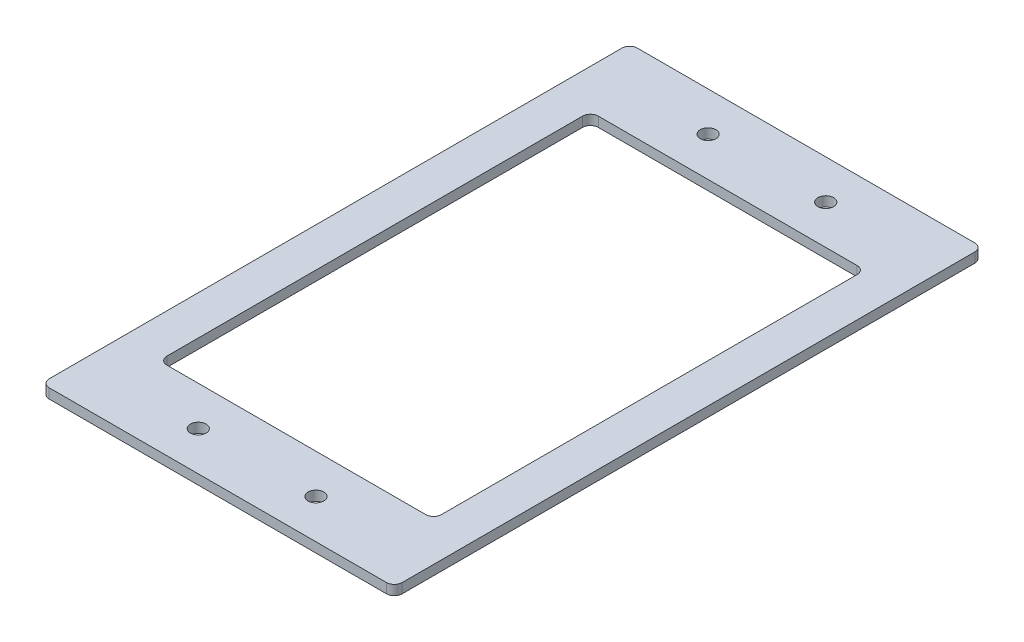
ISO-10303-21;
HEADER;
FILE_DESCRIPTION(('STEP AP214'),'2;1');
FILE_NAME('part.step','',(''),(''),'','','');
FILE_SCHEMA(('AUTOMOTIVE_DESIGN { 1 0 10303 214 1 1 1 1 }'));
ENDSEC;
DATA;
#1=APPLICATION_CONTEXT('core data for automotive mechanical design processes');
#2=APPLICATION_PROTOCOL_DEFINITION('international standard','automotive_design',2000,#1);
#3=PRODUCT_CONTEXT('',#1,'mechanical');
#4=PRODUCT('Part','Part','',(#3));
#5=PRODUCT_RELATED_PRODUCT_CATEGORY('part','',(#4));
#6=PRODUCT_DEFINITION_FORMATION('','',#4);
#7=PRODUCT_DEFINITION_CONTEXT('part definition',#1,'design');
#8=PRODUCT_DEFINITION('design','',#6,#7);
#9=PRODUCT_DEFINITION_SHAPE('','',#8);
#10=(LENGTH_UNIT() NAMED_UNIT(*) SI_UNIT(.MILLI.,.METRE.));
#11=(NAMED_UNIT(*) PLANE_ANGLE_UNIT() SI_UNIT($,.RADIAN.));
#12=(NAMED_UNIT(*) SI_UNIT($,.STERADIAN.) SOLID_ANGLE_UNIT());
#13=UNCERTAINTY_MEASURE_WITH_UNIT(LENGTH_MEASURE(1.E-05),#10,'distance_accuracy_value','');
#14=(GEOMETRIC_REPRESENTATION_CONTEXT(3) GLOBAL_UNCERTAINTY_ASSIGNED_CONTEXT((#13)) GLOBAL_UNIT_ASSIGNED_CONTEXT((#10,
#11,#12)) REPRESENTATION_CONTEXT('',''));
#15=CARTESIAN_POINT('',(0.,0.,0.));
#16=DIRECTION('',(0.,0.,1.));
#17=DIRECTION('',(1.,0.,0.));
#18=AXIS2_PLACEMENT_3D('',#15,#16,#17);
#19=CARTESIAN_POINT('',(0.,3.175,0.));
#20=DIRECTION('',(0.,1.,0.));
#21=DIRECTION('',(0.,0.,1.));
#22=AXIS2_PLACEMENT_3D('',#19,#20,#21);
#23=PLANE('',#22);
#24=CARTESIAN_POINT('',(-19.05,3.175,-82.55));
#25=DIRECTION('',(0.,1.,0.));
#26=DIRECTION('',(0.,0.,1.));
#27=AXIS2_PLACEMENT_3D('',#24,#25,#26);
#28=CIRCLE('',#27,2.53999999999999);
#29=CARTESIAN_POINT('',(-19.05,3.175,-80.01));
#30=VERTEX_POINT('',#29);
#31=EDGE_CURVE('E280',#30,#30,#28,.T.);
#32=ORIENTED_EDGE('',*,*,#31,.F.);
#33=EDGE_LOOP('',(#32));
#34=FACE_BOUND('',#33,.T.);
#35=CARTESIAN_POINT('',(-19.05,3.175,82.55));
#36=DIRECTION('',(0.,1.,0.));
#37=DIRECTION('',(0.,0.,-1.));
#38=AXIS2_PLACEMENT_3D('',#35,#36,#37);
#39=CIRCLE('',#38,2.53999999999999);
#40=CARTESIAN_POINT('',(-19.05,3.175,85.09));
#41=VERTEX_POINT('',#40);
#42=EDGE_CURVE('E270',#41,#41,#39,.T.);
#43=ORIENTED_EDGE('',*,*,#42,.F.);
#44=EDGE_LOOP('',(#43));
#45=FACE_BOUND('',#44,.T.);
#46=CARTESIAN_POINT('',(19.05,3.175,-82.55));
#47=DIRECTION('',(0.,1.,0.));
#48=DIRECTION('',(0.,0.,-1.));
#49=AXIS2_PLACEMENT_3D('',#46,#47,#48);
#50=CIRCLE('',#49,2.53999999999999);
#51=CARTESIAN_POINT('',(19.05,3.175,-80.01));
#52=VERTEX_POINT('',#51);
#53=EDGE_CURVE('E267',#52,#52,#50,.T.);
#54=ORIENTED_EDGE('',*,*,#53,.F.);
#55=EDGE_LOOP('',(#54));
#56=FACE_BOUND('',#55,.T.);
#57=CARTESIAN_POINT('',(19.05,3.175,82.55));
#58=DIRECTION('',(0.,1.,0.));
#59=DIRECTION('',(0.,0.,1.));
#60=AXIS2_PLACEMENT_3D('',#57,#58,#59);
#61=CIRCLE('',#60,2.53999999999999);
#62=CARTESIAN_POINT('',(19.05,3.175,85.09));
#63=VERTEX_POINT('',#62);
#64=EDGE_CURVE('E264',#63,#63,#61,.T.);
#65=ORIENTED_EDGE('',*,*,#64,.F.);
#66=EDGE_LOOP('',(#65));
#67=FACE_BOUND('',#66,.T.);
#68=DIRECTION('',(0.,0.,1.));
#69=VECTOR('',#68,1.);
#70=CARTESIAN_POINT('',(-57.15,3.175,95.25));
#71=LINE('',#70,#69);
#72=CARTESIAN_POINT('',(-57.15,3.175,-92.71));
#73=VERTEX_POINT('',#72);
#74=CARTESIAN_POINT('',(-57.15,3.175,92.71));
#75=VERTEX_POINT('',#74);
#76=EDGE_CURVE('E254',#73,#75,#71,.T.);
#77=ORIENTED_EDGE('',*,*,#76,.T.);
#78=CARTESIAN_POINT('',(-54.61,3.175,92.71));
#79=DIRECTION('',(0.,1.,0.));
#80=DIRECTION('',(0.,0.,1.));
#81=AXIS2_PLACEMENT_3D('',#78,#79,#80);
#82=CIRCLE('',#81,2.54);
#83=CARTESIAN_POINT('',(-54.61,3.175,95.25));
#84=VERTEX_POINT('',#83);
#85=EDGE_CURVE('E231',#75,#84,#82,.T.);
#86=ORIENTED_EDGE('',*,*,#85,.T.);
#87=DIRECTION('',(1.,0.,0.));
#88=VECTOR('',#87,1.);
#89=CARTESIAN_POINT('',(57.15,3.175,95.25));
#90=LINE('',#89,#88);
#91=CARTESIAN_POINT('',(54.61,3.175,95.25));
#92=VERTEX_POINT('',#91);
#93=EDGE_CURVE('E302',#84,#92,#90,.T.);
#94=ORIENTED_EDGE('',*,*,#93,.T.);
#95=CARTESIAN_POINT('',(54.61,3.175,92.71));
#96=DIRECTION('',(0.,1.,0.));
#97=DIRECTION('',(0.,0.,1.));
#98=AXIS2_PLACEMENT_3D('',#95,#96,#97);
#99=CIRCLE('',#98,2.54);
#100=CARTESIAN_POINT('',(57.15,3.175,92.71));
#101=VERTEX_POINT('',#100);
#102=EDGE_CURVE('E226',#92,#101,#99,.T.);
#103=ORIENTED_EDGE('',*,*,#102,.T.);
#104=DIRECTION('',(0.,0.,-1.));
#105=VECTOR('',#104,1.);
#106=CARTESIAN_POINT('',(57.15,3.175,95.25));
#107=LINE('',#106,#105);
#108=CARTESIAN_POINT('',(57.15,3.175,-92.71));
#109=VERTEX_POINT('',#108);
#110=EDGE_CURVE('E177',#101,#109,#107,.T.);
#111=ORIENTED_EDGE('',*,*,#110,.T.);
#112=CARTESIAN_POINT('',(54.61,3.175,-92.71));
#113=DIRECTION('',(0.,1.,0.));
#114=DIRECTION('',(0.,0.,1.));
#115=AXIS2_PLACEMENT_3D('',#112,#113,#114);
#116=CIRCLE('',#115,2.54);
#117=CARTESIAN_POINT('',(54.61,3.175,-95.25));
#118=VERTEX_POINT('',#117);
#119=EDGE_CURVE('E55',#109,#118,#116,.T.);
#120=ORIENTED_EDGE('',*,*,#119,.T.);
#121=DIRECTION('',(-1.,0.,0.));
#122=VECTOR('',#121,1.);
#123=CARTESIAN_POINT('',(57.15,3.175,-95.25));
#124=LINE('',#123,#122);
#125=CARTESIAN_POINT('',(-54.61,3.175,-95.25));
#126=VERTEX_POINT('',#125);
#127=EDGE_CURVE('E173',#118,#126,#124,.T.);
#128=ORIENTED_EDGE('',*,*,#127,.T.);
#129=CARTESIAN_POINT('',(-54.61,3.175,-92.71));
#130=DIRECTION('',(0.,1.,0.));
#131=DIRECTION('',(0.,0.,1.));
#132=AXIS2_PLACEMENT_3D('',#129,#130,#131);
#133=CIRCLE('',#132,2.54);
#134=EDGE_CURVE('E229',#126,#73,#133,.T.);
#135=ORIENTED_EDGE('',*,*,#134,.T.);
#136=EDGE_LOOP('',(#77,#86,#94,#103,#111,#120,#128,#135));
#137=FACE_BOUND('',#136,.T.);
#138=DIRECTION('',(1.,0.,0.));
#139=VECTOR('',#138,1.);
#140=CARTESIAN_POINT('',(44.45,3.175,69.85));
#141=LINE('',#140,#139);
#142=CARTESIAN_POINT('',(-41.91,3.175,69.85));
#143=VERTEX_POINT('',#142);
#144=CARTESIAN_POINT('',(41.91,3.175,69.85));
#145=VERTEX_POINT('',#144);
#146=EDGE_CURVE('E288',#143,#145,#141,.T.);
#147=ORIENTED_EDGE('',*,*,#146,.F.);
#148=CARTESIAN_POINT('',(-41.91,3.175,67.31));
#149=DIRECTION('',(0.,1.,0.));
#150=DIRECTION('',(0.,0.,1.));
#151=AXIS2_PLACEMENT_3D('',#148,#149,#150);
#152=CIRCLE('',#151,2.54);
#153=CARTESIAN_POINT('',(-44.45,3.175,67.31));
#154=VERTEX_POINT('',#153);
#155=EDGE_CURVE('E159',#143,#154,#152,.F.);
#156=ORIENTED_EDGE('',*,*,#155,.T.);
#157=DIRECTION('',(0.,0.,1.));
#158=VECTOR('',#157,1.);
#159=CARTESIAN_POINT('',(-44.45,3.175,69.85));
#160=LINE('',#159,#158);
#161=CARTESIAN_POINT('',(-44.45,3.175,-67.31));
#162=VERTEX_POINT('',#161);
#163=EDGE_CURVE('E285',#162,#154,#160,.T.);
#164=ORIENTED_EDGE('',*,*,#163,.F.);
#165=CARTESIAN_POINT('',(-41.91,3.175,-67.31));
#166=DIRECTION('',(0.,1.,0.));
#167=DIRECTION('',(0.,0.,1.));
#168=AXIS2_PLACEMENT_3D('',#165,#166,#167);
#169=CIRCLE('',#168,2.54);
#170=CARTESIAN_POINT('',(-41.91,3.175,-69.85));
#171=VERTEX_POINT('',#170);
#172=EDGE_CURVE('E202',#162,#171,#169,.F.);
#173=ORIENTED_EDGE('',*,*,#172,.T.);
#174=DIRECTION('',(-1.,0.,0.));
#175=VECTOR('',#174,1.);
#176=CARTESIAN_POINT('',(44.45,3.175,-69.85));
#177=LINE('',#176,#175);
#178=CARTESIAN_POINT('',(41.91,3.175,-69.85));
#179=VERTEX_POINT('',#178);
#180=EDGE_CURVE('E293',#179,#171,#177,.T.);
#181=ORIENTED_EDGE('',*,*,#180,.F.);
#182=CARTESIAN_POINT('',(41.91,3.175,-67.31));
#183=DIRECTION('',(0.,1.,0.));
#184=DIRECTION('',(0.,0.,1.));
#185=AXIS2_PLACEMENT_3D('',#182,#183,#184);
#186=CIRCLE('',#185,2.54);
#187=CARTESIAN_POINT('',(44.45,3.175,-67.31));
#188=VERTEX_POINT('',#187);
#189=EDGE_CURVE('E198',#179,#188,#186,.F.);
#190=ORIENTED_EDGE('',*,*,#189,.T.);
#191=DIRECTION('',(0.,0.,-1.));
#192=VECTOR('',#191,1.);
#193=CARTESIAN_POINT('',(44.45,3.175,69.85));
#194=LINE('',#193,#192);
#195=CARTESIAN_POINT('',(44.45,3.175,67.31));
#196=VERTEX_POINT('',#195);
#197=EDGE_CURVE('E291',#196,#188,#194,.T.);
#198=ORIENTED_EDGE('',*,*,#197,.F.);
#199=CARTESIAN_POINT('',(41.91,3.175,67.31));
#200=DIRECTION('',(0.,1.,0.));
#201=DIRECTION('',(0.,0.,1.));
#202=AXIS2_PLACEMENT_3D('',#199,#200,#201);
#203=CIRCLE('',#202,2.54);
#204=EDGE_CURVE('E158',#196,#145,#203,.F.);
#205=ORIENTED_EDGE('',*,*,#204,.T.);
#206=EDGE_LOOP('',(#147,#156,#164,#173,#181,#190,#198,#205));
#207=FACE_BOUND('',#206,.T.);
#208=ADVANCED_FACE('F33',(#34,#45,#56,#67,#137,#207),#23,.T.);
#209=CARTESIAN_POINT('',(0.,0.,0.));
#210=DIRECTION('',(0.,1.,0.));
#211=DIRECTION('',(0.,0.,1.));
#212=AXIS2_PLACEMENT_3D('',#209,#210,#211);
#213=PLANE('',#212);
#214=CARTESIAN_POINT('',(-19.05,0.,-82.55));
#215=DIRECTION('',(0.,1.,0.));
#216=DIRECTION('',(0.,0.,1.));
#217=AXIS2_PLACEMENT_3D('',#214,#215,#216);
#218=CIRCLE('',#217,2.53999999999999);
#219=CARTESIAN_POINT('',(-19.05,0.,-80.01));
#220=VERTEX_POINT('',#219);
#221=EDGE_CURVE('E180',#220,#220,#218,.T.);
#222=ORIENTED_EDGE('',*,*,#221,.T.);
#223=EDGE_LOOP('',(#222));
#224=FACE_BOUND('',#223,.T.);
#225=CARTESIAN_POINT('',(-19.05,0.,82.55));
#226=DIRECTION('',(0.,1.,0.));
#227=DIRECTION('',(0.,0.,1.));
#228=AXIS2_PLACEMENT_3D('',#225,#226,#227);
#229=CIRCLE('',#228,2.53999999999999);
#230=CARTESIAN_POINT('',(-19.05,0.,85.09));
#231=VERTEX_POINT('',#230);
#232=EDGE_CURVE('E268',#231,#231,#229,.T.);
#233=ORIENTED_EDGE('',*,*,#232,.T.);
#234=EDGE_LOOP('',(#233));
#235=FACE_BOUND('',#234,.T.);
#236=CARTESIAN_POINT('',(19.05,0.,-82.55));
#237=DIRECTION('',(0.,1.,0.));
#238=DIRECTION('',(0.,0.,1.));
#239=AXIS2_PLACEMENT_3D('',#236,#237,#238);
#240=CIRCLE('',#239,2.53999999999999);
#241=CARTESIAN_POINT('',(19.05,0.,-80.01));
#242=VERTEX_POINT('',#241);
#243=EDGE_CURVE('E265',#242,#242,#240,.T.);
#244=ORIENTED_EDGE('',*,*,#243,.T.);
#245=EDGE_LOOP('',(#244));
#246=FACE_BOUND('',#245,.T.);
#247=CARTESIAN_POINT('',(19.05,0.,82.55));
#248=DIRECTION('',(0.,1.,0.));
#249=DIRECTION('',(0.,0.,1.));
#250=AXIS2_PLACEMENT_3D('',#247,#248,#249);
#251=CIRCLE('',#250,2.53999999999999);
#252=CARTESIAN_POINT('',(19.05,0.,85.09));
#253=VERTEX_POINT('',#252);
#254=EDGE_CURVE('E260',#253,#253,#251,.T.);
#255=ORIENTED_EDGE('',*,*,#254,.T.);
#256=EDGE_LOOP('',(#255));
#257=FACE_BOUND('',#256,.T.);
#258=DIRECTION('',(1.,0.,0.));
#259=VECTOR('',#258,1.);
#260=CARTESIAN_POINT('',(57.15,0.,95.25));
#261=LINE('',#260,#259);
#262=CARTESIAN_POINT('',(-54.61,0.,95.25));
#263=VERTEX_POINT('',#262);
#264=CARTESIAN_POINT('',(54.61,0.,95.25));
#265=VERTEX_POINT('',#264);
#266=EDGE_CURVE('E252',#263,#265,#261,.T.);
#267=ORIENTED_EDGE('',*,*,#266,.F.);
#268=CARTESIAN_POINT('',(-54.61,0.,92.71));
#269=DIRECTION('',(0.,1.,0.));
#270=DIRECTION('',(0.,0.,1.));
#271=AXIS2_PLACEMENT_3D('',#268,#269,#270);
#272=CIRCLE('',#271,2.54);
#273=CARTESIAN_POINT('',(-57.15,0.,92.71));
#274=VERTEX_POINT('',#273);
#275=EDGE_CURVE('E219',#263,#274,#272,.F.);
#276=ORIENTED_EDGE('',*,*,#275,.T.);
#277=DIRECTION('',(0.,0.,1.));
#278=VECTOR('',#277,1.);
#279=CARTESIAN_POINT('',(-57.15,0.,95.25));
#280=LINE('',#279,#278);
#281=CARTESIAN_POINT('',(-57.15,0.,-92.71));
#282=VERTEX_POINT('',#281);
#283=EDGE_CURVE('E256',#282,#274,#280,.T.);
#284=ORIENTED_EDGE('',*,*,#283,.F.);
#285=CARTESIAN_POINT('',(-54.61,0.,-92.71));
#286=DIRECTION('',(0.,1.,0.));
#287=DIRECTION('',(0.,0.,1.));
#288=AXIS2_PLACEMENT_3D('',#285,#286,#287);
#289=CIRCLE('',#288,2.54);
#290=CARTESIAN_POINT('',(-54.61,0.,-95.25));
#291=VERTEX_POINT('',#290);
#292=EDGE_CURVE('E217',#282,#291,#289,.F.);
#293=ORIENTED_EDGE('',*,*,#292,.T.);
#294=DIRECTION('',(-1.,0.,0.));
#295=VECTOR('',#294,1.);
#296=CARTESIAN_POINT('',(57.15,0.,-95.25));
#297=LINE('',#296,#295);
#298=CARTESIAN_POINT('',(54.61,0.,-95.25));
#299=VERTEX_POINT('',#298);
#300=EDGE_CURVE('E251',#299,#291,#297,.T.);
#301=ORIENTED_EDGE('',*,*,#300,.F.);
#302=CARTESIAN_POINT('',(54.61,0.,-92.71));
#303=DIRECTION('',(0.,1.,0.));
#304=DIRECTION('',(0.,0.,1.));
#305=AXIS2_PLACEMENT_3D('',#302,#303,#304);
#306=CIRCLE('',#305,2.54);
#307=CARTESIAN_POINT('',(57.15,0.,-92.71));
#308=VERTEX_POINT('',#307);
#309=EDGE_CURVE('E215',#299,#308,#306,.F.);
#310=ORIENTED_EDGE('',*,*,#309,.T.);
#311=DIRECTION('',(0.,0.,-1.));
#312=VECTOR('',#311,1.);
#313=CARTESIAN_POINT('',(57.15,0.,95.25));
#314=LINE('',#313,#312);
#315=CARTESIAN_POINT('',(57.15,0.,92.71));
#316=VERTEX_POINT('',#315);
#317=EDGE_CURVE('E243',#316,#308,#314,.T.);
#318=ORIENTED_EDGE('',*,*,#317,.F.);
#319=CARTESIAN_POINT('',(54.61,0.,92.71));
#320=DIRECTION('',(0.,1.,0.));
#321=DIRECTION('',(0.,0.,1.));
#322=AXIS2_PLACEMENT_3D('',#319,#320,#321);
#323=CIRCLE('',#322,2.54);
#324=EDGE_CURVE('E213',#316,#265,#323,.F.);
#325=ORIENTED_EDGE('',*,*,#324,.T.);
#326=EDGE_LOOP('',(#267,#276,#284,#293,#301,#310,#318,#325));
#327=FACE_BOUND('',#326,.T.);
#328=DIRECTION('',(-1.,0.,0.));
#329=VECTOR('',#328,1.);
#330=CARTESIAN_POINT('',(44.45,0.,-69.85));
#331=LINE('',#330,#329);
#332=CARTESIAN_POINT('',(41.91,0.,-69.85));
#333=VERTEX_POINT('',#332);
#334=CARTESIAN_POINT('',(-41.91,0.,-69.85));
#335=VERTEX_POINT('',#334);
#336=EDGE_CURVE('E169',#333,#335,#331,.T.);
#337=ORIENTED_EDGE('',*,*,#336,.T.);
#338=CARTESIAN_POINT('',(-41.91,0.,-67.31));
#339=DIRECTION('',(0.,1.,0.));
#340=DIRECTION('',(0.,0.,1.));
#341=AXIS2_PLACEMENT_3D('',#338,#339,#340);
#342=CIRCLE('',#341,2.54);
#343=CARTESIAN_POINT('',(-44.45,0.,-67.31));
#344=VERTEX_POINT('',#343);
#345=EDGE_CURVE('E200',#335,#344,#342,.T.);
#346=ORIENTED_EDGE('',*,*,#345,.T.);
#347=DIRECTION('',(0.,0.,1.));
#348=VECTOR('',#347,1.);
#349=CARTESIAN_POINT('',(-44.45,0.,69.85));
#350=LINE('',#349,#348);
#351=CARTESIAN_POINT('',(-44.45,0.,67.31));
#352=VERTEX_POINT('',#351);
#353=EDGE_CURVE('E263',#344,#352,#350,.T.);
#354=ORIENTED_EDGE('',*,*,#353,.T.);
#355=CARTESIAN_POINT('',(-41.91,0.,67.31));
#356=DIRECTION('',(0.,1.,0.));
#357=DIRECTION('',(0.,0.,1.));
#358=AXIS2_PLACEMENT_3D('',#355,#356,#357);
#359=CIRCLE('',#358,2.54);
#360=CARTESIAN_POINT('',(-41.91,0.,69.85));
#361=VERTEX_POINT('',#360);
#362=EDGE_CURVE('E204',#352,#361,#359,.T.);
#363=ORIENTED_EDGE('',*,*,#362,.T.);
#364=DIRECTION('',(1.,0.,0.));
#365=VECTOR('',#364,1.);
#366=CARTESIAN_POINT('',(44.45,0.,69.85));
#367=LINE('',#366,#365);
#368=CARTESIAN_POINT('',(41.91,0.,69.85));
#369=VERTEX_POINT('',#368);
#370=EDGE_CURVE('E153',#361,#369,#367,.T.);
#371=ORIENTED_EDGE('',*,*,#370,.T.);
#372=CARTESIAN_POINT('',(41.91,0.,67.31));
#373=DIRECTION('',(0.,1.,0.));
#374=DIRECTION('',(0.,0.,1.));
#375=AXIS2_PLACEMENT_3D('',#372,#373,#374);
#376=CIRCLE('',#375,2.54);
#377=CARTESIAN_POINT('',(44.45,0.,67.31));
#378=VERTEX_POINT('',#377);
#379=EDGE_CURVE('E147',#369,#378,#376,.T.);
#380=ORIENTED_EDGE('',*,*,#379,.T.);
#381=DIRECTION('',(0.,0.,-1.));
#382=VECTOR('',#381,1.);
#383=CARTESIAN_POINT('',(44.45,0.,69.85));
#384=LINE('',#383,#382);
#385=CARTESIAN_POINT('',(44.45,0.,-67.31));
#386=VERTEX_POINT('',#385);
#387=EDGE_CURVE('E151',#378,#386,#384,.T.);
#388=ORIENTED_EDGE('',*,*,#387,.T.);
#389=CARTESIAN_POINT('',(41.91,0.,-67.31));
#390=DIRECTION('',(0.,1.,0.));
#391=DIRECTION('',(0.,0.,1.));
#392=AXIS2_PLACEMENT_3D('',#389,#390,#391);
#393=CIRCLE('',#392,2.54);
#394=EDGE_CURVE('E196',#386,#333,#393,.T.);
#395=ORIENTED_EDGE('',*,*,#394,.T.);
#396=EDGE_LOOP('',(#337,#346,#354,#363,#371,#380,#388,#395));
#397=FACE_BOUND('',#396,.T.);
#398=ADVANCED_FACE('F150',(#224,#235,#246,#257,#327,#397),#213,.F.);
#399=CARTESIAN_POINT('',(-57.15,3.175,95.25));
#400=DIRECTION('',(1.,0.,0.));
#401=DIRECTION('',(0.,0.,-1.));
#402=AXIS2_PLACEMENT_3D('',#399,#400,#401);
#403=PLANE('',#402);
#404=ORIENTED_EDGE('',*,*,#283,.T.);
#405=DIRECTION('',(0.,-1.,0.));
#406=VECTOR('',#405,1.);
#407=CARTESIAN_POINT('',(-57.15,3.175,92.71));
#408=LINE('',#407,#406);
#409=EDGE_CURVE('E224',#274,#75,#408,.F.);
#410=ORIENTED_EDGE('',*,*,#409,.T.);
#411=ORIENTED_EDGE('',*,*,#76,.F.);
#412=DIRECTION('',(0.,-1.,0.));
#413=VECTOR('',#412,1.);
#414=CARTESIAN_POINT('',(-57.15,3.175,-92.71));
#415=LINE('',#414,#413);
#416=EDGE_CURVE('E221',#73,#282,#415,.T.);
#417=ORIENTED_EDGE('',*,*,#416,.T.);
#418=EDGE_LOOP('',(#404,#410,#411,#417));
#419=FACE_BOUND('',#418,.T.);
#420=ADVANCED_FACE('F309',(#419),#403,.F.);
#421=CARTESIAN_POINT('',(57.15,3.175,95.25));
#422=DIRECTION('',(0.,0.,-1.));
#423=DIRECTION('',(-1.,0.,0.));
#424=AXIS2_PLACEMENT_3D('',#421,#422,#423);
#425=PLANE('',#424);
#426=ORIENTED_EDGE('',*,*,#93,.F.);
#427=DIRECTION('',(0.,-1.,0.));
#428=VECTOR('',#427,1.);
#429=CARTESIAN_POINT('',(-54.61,3.175,95.25));
#430=LINE('',#429,#428);
#431=EDGE_CURVE('E210',#84,#263,#430,.T.);
#432=ORIENTED_EDGE('',*,*,#431,.T.);
#433=ORIENTED_EDGE('',*,*,#266,.T.);
#434=DIRECTION('',(0.,-1.,0.));
#435=VECTOR('',#434,1.);
#436=CARTESIAN_POINT('',(54.61,3.175,95.25));
#437=LINE('',#436,#435);
#438=EDGE_CURVE('E208',#265,#92,#437,.F.);
#439=ORIENTED_EDGE('',*,*,#438,.T.);
#440=EDGE_LOOP('',(#426,#432,#433,#439));
#441=FACE_BOUND('',#440,.T.);
#442=ADVANCED_FACE('F319',(#441),#425,.F.);
#443=CARTESIAN_POINT('',(57.15,3.175,95.25));
#444=DIRECTION('',(-1.,0.,0.));
#445=DIRECTION('',(0.,0.,1.));
#446=AXIS2_PLACEMENT_3D('',#443,#444,#445);
#447=PLANE('',#446);
#448=ORIENTED_EDGE('',*,*,#317,.T.);
#449=DIRECTION('',(0.,-1.,0.));
#450=VECTOR('',#449,1.);
#451=CARTESIAN_POINT('',(57.15,3.175,-92.71));
#452=LINE('',#451,#450);
#453=EDGE_CURVE('E11',#308,#109,#452,.F.);
#454=ORIENTED_EDGE('',*,*,#453,.T.);
#455=ORIENTED_EDGE('',*,*,#110,.F.);
#456=DIRECTION('',(0.,-1.,0.));
#457=VECTOR('',#456,1.);
#458=CARTESIAN_POINT('',(57.15,3.175,92.71));
#459=LINE('',#458,#457);
#460=EDGE_CURVE('E41',#101,#316,#459,.T.);
#461=ORIENTED_EDGE('',*,*,#460,.T.);
#462=EDGE_LOOP('',(#448,#454,#455,#461));
#463=FACE_BOUND('',#462,.T.);
#464=ADVANCED_FACE('F242',(#463),#447,.F.);
#465=CARTESIAN_POINT('',(57.15,3.175,-95.25));
#466=DIRECTION('',(0.,0.,1.));
#467=DIRECTION('',(1.,0.,0.));
#468=AXIS2_PLACEMENT_3D('',#465,#466,#467);
#469=PLANE('',#468);
#470=ORIENTED_EDGE('',*,*,#300,.T.);
#471=DIRECTION('',(0.,-1.,0.));
#472=VECTOR('',#471,1.);
#473=CARTESIAN_POINT('',(-54.61,3.175,-95.25));
#474=LINE('',#473,#472);
#475=EDGE_CURVE('E48',#291,#126,#474,.F.);
#476=ORIENTED_EDGE('',*,*,#475,.T.);
#477=ORIENTED_EDGE('',*,*,#127,.F.);
#478=DIRECTION('',(0.,-1.,0.));
#479=VECTOR('',#478,1.);
#480=CARTESIAN_POINT('',(54.61,3.175,-95.25));
#481=LINE('',#480,#479);
#482=EDGE_CURVE('E233',#118,#299,#481,.T.);
#483=ORIENTED_EDGE('',*,*,#482,.T.);
#484=EDGE_LOOP('',(#470,#476,#477,#483));
#485=FACE_BOUND('',#484,.T.);
#486=ADVANCED_FACE('F324',(#485),#469,.F.);
#487=CARTESIAN_POINT('',(-44.45,3.175,69.85));
#488=DIRECTION('',(1.,0.,0.));
#489=DIRECTION('',(0.,0.,-1.));
#490=AXIS2_PLACEMENT_3D('',#487,#488,#489);
#491=PLANE('',#490);
#492=ORIENTED_EDGE('',*,*,#353,.F.);
#493=DIRECTION('',(0.,-1.,0.));
#494=VECTOR('',#493,1.);
#495=CARTESIAN_POINT('',(-44.45,3.175,-67.31));
#496=LINE('',#495,#494);
#497=EDGE_CURVE('E190',#344,#162,#496,.F.);
#498=ORIENTED_EDGE('',*,*,#497,.T.);
#499=ORIENTED_EDGE('',*,*,#163,.T.);
#500=DIRECTION('',(0.,-1.,0.));
#501=VECTOR('',#500,1.);
#502=CARTESIAN_POINT('',(-44.45,0.,67.31));
#503=LINE('',#502,#501);
#504=EDGE_CURVE('E187',#154,#352,#503,.T.);
#505=ORIENTED_EDGE('',*,*,#504,.T.);
#506=EDGE_LOOP('',(#492,#498,#499,#505));
#507=FACE_BOUND('',#506,.T.);
#508=ADVANCED_FACE('F347',(#507),#491,.T.);
#509=CARTESIAN_POINT('',(44.45,3.175,69.85));
#510=DIRECTION('',(0.,0.,-1.));
#511=DIRECTION('',(-1.,0.,0.));
#512=AXIS2_PLACEMENT_3D('',#509,#510,#511);
#513=PLANE('',#512);
#514=ORIENTED_EDGE('',*,*,#370,.F.);
#515=DIRECTION('',(0.,-1.,0.));
#516=VECTOR('',#515,1.);
#517=CARTESIAN_POINT('',(-41.91,3.175,69.85));
#518=LINE('',#517,#516);
#519=EDGE_CURVE('E194',#361,#143,#518,.F.);
#520=ORIENTED_EDGE('',*,*,#519,.T.);
#521=ORIENTED_EDGE('',*,*,#146,.T.);
#522=DIRECTION('',(0.,-1.,0.));
#523=VECTOR('',#522,1.);
#524=CARTESIAN_POINT('',(41.91,0.,69.85));
#525=LINE('',#524,#523);
#526=EDGE_CURVE('E192',#145,#369,#525,.T.);
#527=ORIENTED_EDGE('',*,*,#526,.T.);
#528=EDGE_LOOP('',(#514,#520,#521,#527));
#529=FACE_BOUND('',#528,.T.);
#530=ADVANCED_FACE('F440',(#529),#513,.T.);
#531=CARTESIAN_POINT('',(44.45,3.175,69.85));
#532=DIRECTION('',(-1.,0.,0.));
#533=DIRECTION('',(0.,0.,1.));
#534=AXIS2_PLACEMENT_3D('',#531,#532,#533);
#535=PLANE('',#534);
#536=ORIENTED_EDGE('',*,*,#197,.T.);
#537=DIRECTION('',(0.,-1.,0.));
#538=VECTOR('',#537,1.);
#539=CARTESIAN_POINT('',(44.45,0.,-67.31));
#540=LINE('',#539,#538);
#541=EDGE_CURVE('E168',#188,#386,#540,.T.);
#542=ORIENTED_EDGE('',*,*,#541,.T.);
#543=ORIENTED_EDGE('',*,*,#387,.F.);
#544=DIRECTION('',(0.,-1.,0.));
#545=VECTOR('',#544,1.);
#546=CARTESIAN_POINT('',(44.45,3.175,67.31));
#547=LINE('',#546,#545);
#548=EDGE_CURVE('E165',#378,#196,#547,.F.);
#549=ORIENTED_EDGE('',*,*,#548,.T.);
#550=EDGE_LOOP('',(#536,#542,#543,#549));
#551=FACE_BOUND('',#550,.T.);
#552=ADVANCED_FACE('F164',(#551),#535,.T.);
#553=CARTESIAN_POINT('',(44.45,3.175,-69.85));
#554=DIRECTION('',(0.,0.,1.));
#555=DIRECTION('',(1.,0.,0.));
#556=AXIS2_PLACEMENT_3D('',#553,#554,#555);
#557=PLANE('',#556);
#558=ORIENTED_EDGE('',*,*,#336,.F.);
#559=DIRECTION('',(0.,-1.,0.));
#560=VECTOR('',#559,1.);
#561=CARTESIAN_POINT('',(41.91,3.175,-69.85));
#562=LINE('',#561,#560);
#563=EDGE_CURVE('E185',#333,#179,#562,.F.);
#564=ORIENTED_EDGE('',*,*,#563,.T.);
#565=ORIENTED_EDGE('',*,*,#180,.T.);
#566=DIRECTION('',(0.,-1.,0.));
#567=VECTOR('',#566,1.);
#568=CARTESIAN_POINT('',(-41.91,0.,-69.85));
#569=LINE('',#568,#567);
#570=EDGE_CURVE('E175',#171,#335,#569,.T.);
#571=ORIENTED_EDGE('',*,*,#570,.T.);
#572=EDGE_LOOP('',(#558,#564,#565,#571));
#573=FACE_BOUND('',#572,.T.);
#574=ADVANCED_FACE('F455',(#573),#557,.T.);
#575=CARTESIAN_POINT('',(19.05,-1.5875,82.55));
#576=DIRECTION('',(0.,1.,0.));
#577=DIRECTION('',(0.,0.,1.));
#578=AXIS2_PLACEMENT_3D('',#575,#576,#577);
#579=CYLINDRICAL_SURFACE('',#578,2.53999999999999);
#580=CARTESIAN_POINT('',(19.05,3.175,85.09));
#581=CARTESIAN_POINT('',(19.05,3.14192708333333,85.09));
#582=CARTESIAN_POINT('',(19.05,3.10885416666667,85.09));
#583=CARTESIAN_POINT('',(19.05,3.04270833333333,85.09));
#584=CARTESIAN_POINT('',(19.05,3.00963541666667,85.09));
#585=CARTESIAN_POINT('',(19.05,2.94348958333333,85.09));
#586=CARTESIAN_POINT('',(19.05,2.91041666666667,85.09));
#587=CARTESIAN_POINT('',(19.05,2.84427083333333,85.09));
#588=CARTESIAN_POINT('',(19.05,2.81119791666667,85.09));
#589=CARTESIAN_POINT('',(19.05,2.74505208333333,85.09));
#590=CARTESIAN_POINT('',(19.05,2.71197916666667,85.09));
#591=CARTESIAN_POINT('',(19.05,2.64583333333333,85.09));
#592=CARTESIAN_POINT('',(19.05,2.61276041666667,85.09));
#593=CARTESIAN_POINT('',(19.05,2.54661458333333,85.09));
#594=CARTESIAN_POINT('',(19.05,2.51354166666667,85.09));
#595=CARTESIAN_POINT('',(19.05,2.44739583333333,85.09));
#596=CARTESIAN_POINT('',(19.05,2.41432291666667,85.09));
#597=CARTESIAN_POINT('',(19.05,2.34817708333333,85.09));
#598=CARTESIAN_POINT('',(19.05,2.31510416666667,85.09));
#599=CARTESIAN_POINT('',(19.05,2.24895833333333,85.09));
#600=CARTESIAN_POINT('',(19.05,2.21588541666667,85.09));
#601=CARTESIAN_POINT('',(19.05,2.14973958333333,85.09));
#602=CARTESIAN_POINT('',(19.05,2.11666666666667,85.09));
#603=CARTESIAN_POINT('',(19.05,2.05052083333333,85.09));
#604=CARTESIAN_POINT('',(19.05,2.01744791666667,85.09));
#605=CARTESIAN_POINT('',(19.05,1.95130208333333,85.09));
#606=CARTESIAN_POINT('',(19.05,1.91822916666667,85.09));
#607=CARTESIAN_POINT('',(19.05,1.85208333333333,85.09));
#608=CARTESIAN_POINT('',(19.05,1.81901041666667,85.09));
#609=CARTESIAN_POINT('',(19.05,1.75286458333333,85.09));
#610=CARTESIAN_POINT('',(19.05,1.71979166666667,85.09));
#611=CARTESIAN_POINT('',(19.05,1.65364583333333,85.09));
#612=CARTESIAN_POINT('',(19.05,1.62057291666667,85.09));
#613=CARTESIAN_POINT('',(19.05,1.55442708333333,85.09));
#614=CARTESIAN_POINT('',(19.05,1.52135416666667,85.09));
#615=CARTESIAN_POINT('',(19.05,1.45520833333333,85.09));
#616=CARTESIAN_POINT('',(19.05,1.42213541666667,85.09));
#617=CARTESIAN_POINT('',(19.05,1.35598958333333,85.09));
#618=CARTESIAN_POINT('',(19.05,1.32291666666667,85.09));
#619=CARTESIAN_POINT('',(19.05,1.25677083333333,85.09));
#620=CARTESIAN_POINT('',(19.05,1.22369791666667,85.09));
#621=CARTESIAN_POINT('',(19.05,1.15755208333333,85.09));
#622=CARTESIAN_POINT('',(19.05,1.12447916666667,85.09));
#623=CARTESIAN_POINT('',(19.05,1.05833333333333,85.09));
#624=CARTESIAN_POINT('',(19.05,1.02526041666667,85.09));
#625=CARTESIAN_POINT('',(19.05,0.959114583333333,85.09));
#626=CARTESIAN_POINT('',(19.05,0.926041666666666,85.09));
#627=CARTESIAN_POINT('',(19.05,0.859895833333333,85.09));
#628=CARTESIAN_POINT('',(19.05,0.826822916666666,85.09));
#629=CARTESIAN_POINT('',(19.05,0.760677083333333,85.09));
#630=CARTESIAN_POINT('',(19.05,0.727604166666666,85.09));
#631=CARTESIAN_POINT('',(19.05,0.661458333333333,85.09));
#632=CARTESIAN_POINT('',(19.05,0.628385416666666,85.09));
#633=CARTESIAN_POINT('',(19.05,0.562239583333333,85.09));
#634=CARTESIAN_POINT('',(19.05,0.529166666666666,85.09));
#635=CARTESIAN_POINT('',(19.05,0.463020833333333,85.09));
#636=CARTESIAN_POINT('',(19.05,0.429947916666666,85.09));
#637=CARTESIAN_POINT('',(19.05,0.363802083333333,85.09));
#638=CARTESIAN_POINT('',(19.05,0.330729166666667,85.09));
#639=CARTESIAN_POINT('',(19.05,0.264583333333333,85.09));
#640=CARTESIAN_POINT('',(19.05,0.231510416666666,85.09));
#641=CARTESIAN_POINT('',(19.05,0.165364583333333,85.09));
#642=CARTESIAN_POINT('',(19.05,0.132291666666666,85.09));
#643=CARTESIAN_POINT('',(19.05,0.0661458333333331,85.09));
#644=CARTESIAN_POINT('',(19.05,0.0330729166666665,85.09));
#645=CARTESIAN_POINT('',(19.05,0.,85.09));
#646=B_SPLINE_CURVE_WITH_KNOTS('',3,(#580,#581,#582,#583,#584,#585,#586,#587,#588,#589,#590,
#591,#592,#593,#594,#595,#596,#597,#598,#599,#600,#601,#602,#603,#604,#605,#606,#607,#608,#609,
#610,#611,#612,#613,#614,#615,#616,#617,#618,#619,#620,#621,#622,#623,#624,#625,#626,#627,#628,
#629,#630,#631,#632,#633,#634,#635,#636,#637,#638,#639,#640,#641,#642,#643,#644,#645),
.UNSPECIFIED.,.F.,.F.,(4,2,2,2,2,2,2,2,2,2,2,2,2,2,2,2,2,2,2,2,2,2,2,2,2,2,2,2,2,2,2,2,4),(0.,
0.0992187500000004,0.1984375,0.29765625,0.396875,0.49609375,0.5953125,0.69453125,0.79375,
0.89296875,0.9921875,1.09140625,1.190625,1.28984375,1.3890625,1.48828125,1.5875,1.68671875,
1.7859375,1.88515625,1.984375,2.08359375,2.1828125,2.28203125,2.38125,2.48046875,2.5796875,
2.67890625,2.778125,2.87734375,2.9765625,3.07578125,3.175),.UNSPECIFIED.);
#647=EDGE_CURVE('BSEAM463',#63,#253,#646,.T.);
#648=ORIENTED_EDGE('',*,*,#64,.T.);
#649=ORIENTED_EDGE('',*,*,#254,.F.);
#650=ORIENTED_EDGE('',*,*,#647,.T.);
#651=ORIENTED_EDGE('',*,*,#647,.F.);
#652=EDGE_LOOP('',(#648,#650,#649,#651));
#653=FACE_BOUND('',#652,.T.);
#654=ADVANCED_FACE('F463',(#653),#579,.F.);
#655=CARTESIAN_POINT('',(19.05,-1.5875,-82.55));
#656=DIRECTION('',(0.,1.,0.));
#657=DIRECTION('',(0.,0.,1.));
#658=AXIS2_PLACEMENT_3D('',#655,#656,#657);
#659=CYLINDRICAL_SURFACE('',#658,2.53999999999999);
#660=CARTESIAN_POINT('',(19.05,3.175,-80.01));
#661=CARTESIAN_POINT('',(19.05,3.14192708333333,-80.01));
#662=CARTESIAN_POINT('',(19.05,3.10885416666667,-80.01));
#663=CARTESIAN_POINT('',(19.05,3.04270833333333,-80.01));
#664=CARTESIAN_POINT('',(19.05,3.00963541666667,-80.01));
#665=CARTESIAN_POINT('',(19.05,2.94348958333333,-80.01));
#666=CARTESIAN_POINT('',(19.05,2.91041666666667,-80.01));
#667=CARTESIAN_POINT('',(19.05,2.84427083333333,-80.01));
#668=CARTESIAN_POINT('',(19.05,2.81119791666667,-80.01));
#669=CARTESIAN_POINT('',(19.05,2.74505208333333,-80.01));
#670=CARTESIAN_POINT('',(19.05,2.71197916666667,-80.01));
#671=CARTESIAN_POINT('',(19.05,2.64583333333333,-80.01));
#672=CARTESIAN_POINT('',(19.05,2.61276041666667,-80.01));
#673=CARTESIAN_POINT('',(19.05,2.54661458333333,-80.01));
#674=CARTESIAN_POINT('',(19.05,2.51354166666667,-80.01));
#675=CARTESIAN_POINT('',(19.05,2.44739583333333,-80.01));
#676=CARTESIAN_POINT('',(19.05,2.41432291666667,-80.01));
#677=CARTESIAN_POINT('',(19.05,2.34817708333333,-80.01));
#678=CARTESIAN_POINT('',(19.05,2.31510416666667,-80.01));
#679=CARTESIAN_POINT('',(19.05,2.24895833333333,-80.01));
#680=CARTESIAN_POINT('',(19.05,2.21588541666667,-80.01));
#681=CARTESIAN_POINT('',(19.05,2.14973958333333,-80.01));
#682=CARTESIAN_POINT('',(19.05,2.11666666666667,-80.01));
#683=CARTESIAN_POINT('',(19.05,2.05052083333333,-80.01));
#684=CARTESIAN_POINT('',(19.05,2.01744791666667,-80.01));
#685=CARTESIAN_POINT('',(19.05,1.95130208333333,-80.01));
#686=CARTESIAN_POINT('',(19.05,1.91822916666667,-80.01));
#687=CARTESIAN_POINT('',(19.05,1.85208333333333,-80.01));
#688=CARTESIAN_POINT('',(19.05,1.81901041666667,-80.01));
#689=CARTESIAN_POINT('',(19.05,1.75286458333333,-80.01));
#690=CARTESIAN_POINT('',(19.05,1.71979166666667,-80.01));
#691=CARTESIAN_POINT('',(19.05,1.65364583333333,-80.01));
#692=CARTESIAN_POINT('',(19.05,1.62057291666667,-80.01));
#693=CARTESIAN_POINT('',(19.05,1.55442708333333,-80.01));
#694=CARTESIAN_POINT('',(19.05,1.52135416666667,-80.01));
#695=CARTESIAN_POINT('',(19.05,1.45520833333333,-80.01));
#696=CARTESIAN_POINT('',(19.05,1.42213541666667,-80.01));
#697=CARTESIAN_POINT('',(19.05,1.35598958333333,-80.01));
#698=CARTESIAN_POINT('',(19.05,1.32291666666667,-80.01));
#699=CARTESIAN_POINT('',(19.05,1.25677083333333,-80.01));
#700=CARTESIAN_POINT('',(19.05,1.22369791666667,-80.01));
#701=CARTESIAN_POINT('',(19.05,1.15755208333333,-80.01));
#702=CARTESIAN_POINT('',(19.05,1.12447916666667,-80.01));
#703=CARTESIAN_POINT('',(19.05,1.05833333333333,-80.01));
#704=CARTESIAN_POINT('',(19.05,1.02526041666667,-80.01));
#705=CARTESIAN_POINT('',(19.05,0.959114583333333,-80.01));
#706=CARTESIAN_POINT('',(19.05,0.926041666666666,-80.01));
#707=CARTESIAN_POINT('',(19.05,0.859895833333333,-80.01));
#708=CARTESIAN_POINT('',(19.05,0.826822916666666,-80.01));
#709=CARTESIAN_POINT('',(19.05,0.760677083333333,-80.01));
#710=CARTESIAN_POINT('',(19.05,0.727604166666666,-80.01));
#711=CARTESIAN_POINT('',(19.05,0.661458333333333,-80.01));
#712=CARTESIAN_POINT('',(19.05,0.628385416666666,-80.01));
#713=CARTESIAN_POINT('',(19.05,0.562239583333333,-80.01));
#714=CARTESIAN_POINT('',(19.05,0.529166666666666,-80.01));
#715=CARTESIAN_POINT('',(19.05,0.463020833333333,-80.01));
#716=CARTESIAN_POINT('',(19.05,0.429947916666666,-80.01));
#717=CARTESIAN_POINT('',(19.05,0.363802083333333,-80.01));
#718=CARTESIAN_POINT('',(19.05,0.330729166666667,-80.01));
#719=CARTESIAN_POINT('',(19.05,0.264583333333333,-80.01));
#720=CARTESIAN_POINT('',(19.05,0.231510416666666,-80.01));
#721=CARTESIAN_POINT('',(19.05,0.165364583333333,-80.01));
#722=CARTESIAN_POINT('',(19.05,0.132291666666666,-80.01));
#723=CARTESIAN_POINT('',(19.05,0.0661458333333331,-80.01));
#724=CARTESIAN_POINT('',(19.05,0.0330729166666665,-80.01));
#725=CARTESIAN_POINT('',(19.05,0.,-80.01));
#726=B_SPLINE_CURVE_WITH_KNOTS('',3,(#660,#661,#662,#663,#664,#665,#666,#667,#668,#669,#670,
#671,#672,#673,#674,#675,#676,#677,#678,#679,#680,#681,#682,#683,#684,#685,#686,#687,#688,#689,
#690,#691,#692,#693,#694,#695,#696,#697,#698,#699,#700,#701,#702,#703,#704,#705,#706,#707,#708,
#709,#710,#711,#712,#713,#714,#715,#716,#717,#718,#719,#720,#721,#722,#723,#724,#725),
.UNSPECIFIED.,.F.,.F.,(4,2,2,2,2,2,2,2,2,2,2,2,2,2,2,2,2,2,2,2,2,2,2,2,2,2,2,2,2,2,2,2,4),(0.,
0.0992187500000004,0.1984375,0.29765625,0.396875,0.49609375,0.5953125,0.69453125,0.79375,
0.89296875,0.9921875,1.09140625,1.190625,1.28984375,1.3890625,1.48828125,1.5875,1.68671875,
1.7859375,1.88515625,1.984375,2.08359375,2.1828125,2.28203125,2.38125,2.48046875,2.5796875,
2.67890625,2.778125,2.87734375,2.9765625,3.07578125,3.175),.UNSPECIFIED.);
#727=EDGE_CURVE('BSEAM472',#52,#242,#726,.T.);
#728=ORIENTED_EDGE('',*,*,#53,.T.);
#729=ORIENTED_EDGE('',*,*,#243,.F.);
#730=ORIENTED_EDGE('',*,*,#727,.T.);
#731=ORIENTED_EDGE('',*,*,#727,.F.);
#732=EDGE_LOOP('',(#728,#730,#729,#731));
#733=FACE_BOUND('',#732,.T.);
#734=ADVANCED_FACE('F472',(#733),#659,.F.);
#735=CARTESIAN_POINT('',(-19.05,-1.5875,82.55));
#736=DIRECTION('',(0.,1.,0.));
#737=DIRECTION('',(0.,0.,1.));
#738=AXIS2_PLACEMENT_3D('',#735,#736,#737);
#739=CYLINDRICAL_SURFACE('',#738,2.53999999999999);
#740=CARTESIAN_POINT('',(-19.05,3.175,85.09));
#741=CARTESIAN_POINT('',(-19.05,3.14192708333333,85.09));
#742=CARTESIAN_POINT('',(-19.05,3.10885416666667,85.09));
#743=CARTESIAN_POINT('',(-19.05,3.04270833333333,85.09));
#744=CARTESIAN_POINT('',(-19.05,3.00963541666667,85.09));
#745=CARTESIAN_POINT('',(-19.05,2.94348958333333,85.09));
#746=CARTESIAN_POINT('',(-19.05,2.91041666666667,85.09));
#747=CARTESIAN_POINT('',(-19.05,2.84427083333333,85.09));
#748=CARTESIAN_POINT('',(-19.05,2.81119791666667,85.09));
#749=CARTESIAN_POINT('',(-19.05,2.74505208333333,85.09));
#750=CARTESIAN_POINT('',(-19.05,2.71197916666667,85.09));
#751=CARTESIAN_POINT('',(-19.05,2.64583333333333,85.09));
#752=CARTESIAN_POINT('',(-19.05,2.61276041666667,85.09));
#753=CARTESIAN_POINT('',(-19.05,2.54661458333333,85.09));
#754=CARTESIAN_POINT('',(-19.05,2.51354166666667,85.09));
#755=CARTESIAN_POINT('',(-19.05,2.44739583333333,85.09));
#756=CARTESIAN_POINT('',(-19.05,2.41432291666667,85.09));
#757=CARTESIAN_POINT('',(-19.05,2.34817708333333,85.09));
#758=CARTESIAN_POINT('',(-19.05,2.31510416666667,85.09));
#759=CARTESIAN_POINT('',(-19.05,2.24895833333333,85.09));
#760=CARTESIAN_POINT('',(-19.05,2.21588541666667,85.09));
#761=CARTESIAN_POINT('',(-19.05,2.14973958333333,85.09));
#762=CARTESIAN_POINT('',(-19.05,2.11666666666667,85.09));
#763=CARTESIAN_POINT('',(-19.05,2.05052083333333,85.09));
#764=CARTESIAN_POINT('',(-19.05,2.01744791666667,85.09));
#765=CARTESIAN_POINT('',(-19.05,1.95130208333333,85.09));
#766=CARTESIAN_POINT('',(-19.05,1.91822916666667,85.09));
#767=CARTESIAN_POINT('',(-19.05,1.85208333333333,85.09));
#768=CARTESIAN_POINT('',(-19.05,1.81901041666667,85.09));
#769=CARTESIAN_POINT('',(-19.05,1.75286458333333,85.09));
#770=CARTESIAN_POINT('',(-19.05,1.71979166666667,85.09));
#771=CARTESIAN_POINT('',(-19.05,1.65364583333333,85.09));
#772=CARTESIAN_POINT('',(-19.05,1.62057291666667,85.09));
#773=CARTESIAN_POINT('',(-19.05,1.55442708333333,85.09));
#774=CARTESIAN_POINT('',(-19.05,1.52135416666667,85.09));
#775=CARTESIAN_POINT('',(-19.05,1.45520833333333,85.09));
#776=CARTESIAN_POINT('',(-19.05,1.42213541666667,85.09));
#777=CARTESIAN_POINT('',(-19.05,1.35598958333333,85.09));
#778=CARTESIAN_POINT('',(-19.05,1.32291666666667,85.09));
#779=CARTESIAN_POINT('',(-19.05,1.25677083333333,85.09));
#780=CARTESIAN_POINT('',(-19.05,1.22369791666667,85.09));
#781=CARTESIAN_POINT('',(-19.05,1.15755208333333,85.09));
#782=CARTESIAN_POINT('',(-19.05,1.12447916666667,85.09));
#783=CARTESIAN_POINT('',(-19.05,1.05833333333333,85.09));
#784=CARTESIAN_POINT('',(-19.05,1.02526041666667,85.09));
#785=CARTESIAN_POINT('',(-19.05,0.959114583333333,85.09));
#786=CARTESIAN_POINT('',(-19.05,0.926041666666666,85.09));
#787=CARTESIAN_POINT('',(-19.05,0.859895833333333,85.09));
#788=CARTESIAN_POINT('',(-19.05,0.826822916666666,85.09));
#789=CARTESIAN_POINT('',(-19.05,0.760677083333333,85.09));
#790=CARTESIAN_POINT('',(-19.05,0.727604166666666,85.09));
#791=CARTESIAN_POINT('',(-19.05,0.661458333333333,85.09));
#792=CARTESIAN_POINT('',(-19.05,0.628385416666666,85.09));
#793=CARTESIAN_POINT('',(-19.05,0.562239583333333,85.09));
#794=CARTESIAN_POINT('',(-19.05,0.529166666666666,85.09));
#795=CARTESIAN_POINT('',(-19.05,0.463020833333333,85.09));
#796=CARTESIAN_POINT('',(-19.05,0.429947916666666,85.09));
#797=CARTESIAN_POINT('',(-19.05,0.363802083333333,85.09));
#798=CARTESIAN_POINT('',(-19.05,0.330729166666667,85.09));
#799=CARTESIAN_POINT('',(-19.05,0.264583333333333,85.09));
#800=CARTESIAN_POINT('',(-19.05,0.231510416666666,85.09));
#801=CARTESIAN_POINT('',(-19.05,0.165364583333333,85.09));
#802=CARTESIAN_POINT('',(-19.05,0.132291666666666,85.09));
#803=CARTESIAN_POINT('',(-19.05,0.0661458333333331,85.09));
#804=CARTESIAN_POINT('',(-19.05,0.0330729166666665,85.09));
#805=CARTESIAN_POINT('',(-19.05,0.,85.09));
#806=B_SPLINE_CURVE_WITH_KNOTS('',3,(#740,#741,#742,#743,#744,#745,#746,#747,#748,#749,#750,
#751,#752,#753,#754,#755,#756,#757,#758,#759,#760,#761,#762,#763,#764,#765,#766,#767,#768,#769,
#770,#771,#772,#773,#774,#775,#776,#777,#778,#779,#780,#781,#782,#783,#784,#785,#786,#787,#788,
#789,#790,#791,#792,#793,#794,#795,#796,#797,#798,#799,#800,#801,#802,#803,#804,#805),
.UNSPECIFIED.,.F.,.F.,(4,2,2,2,2,2,2,2,2,2,2,2,2,2,2,2,2,2,2,2,2,2,2,2,2,2,2,2,2,2,2,2,4),(0.,
0.0992187500000004,0.1984375,0.29765625,0.396875,0.49609375,0.5953125,0.69453125,0.79375,
0.89296875,0.9921875,1.09140625,1.190625,1.28984375,1.3890625,1.48828125,1.5875,1.68671875,
1.7859375,1.88515625,1.984375,2.08359375,2.1828125,2.28203125,2.38125,2.48046875,2.5796875,
2.67890625,2.778125,2.87734375,2.9765625,3.07578125,3.175),.UNSPECIFIED.);
#807=EDGE_CURVE('BSEAM481',#41,#231,#806,.T.);
#808=ORIENTED_EDGE('',*,*,#42,.T.);
#809=ORIENTED_EDGE('',*,*,#232,.F.);
#810=ORIENTED_EDGE('',*,*,#807,.T.);
#811=ORIENTED_EDGE('',*,*,#807,.F.);
#812=EDGE_LOOP('',(#808,#810,#809,#811));
#813=FACE_BOUND('',#812,.T.);
#814=ADVANCED_FACE('F481',(#813),#739,.F.);
#815=CARTESIAN_POINT('',(-19.05,-1.5875,-82.55));
#816=DIRECTION('',(0.,1.,0.));
#817=DIRECTION('',(0.,0.,1.));
#818=AXIS2_PLACEMENT_3D('',#815,#816,#817);
#819=CYLINDRICAL_SURFACE('',#818,2.53999999999999);
#820=CARTESIAN_POINT('',(-19.05,3.175,-80.01));
#821=CARTESIAN_POINT('',(-19.05,3.14192708333333,-80.01));
#822=CARTESIAN_POINT('',(-19.05,3.10885416666667,-80.01));
#823=CARTESIAN_POINT('',(-19.05,3.04270833333333,-80.01));
#824=CARTESIAN_POINT('',(-19.05,3.00963541666667,-80.01));
#825=CARTESIAN_POINT('',(-19.05,2.94348958333333,-80.01));
#826=CARTESIAN_POINT('',(-19.05,2.91041666666667,-80.01));
#827=CARTESIAN_POINT('',(-19.05,2.84427083333333,-80.01));
#828=CARTESIAN_POINT('',(-19.05,2.81119791666667,-80.01));
#829=CARTESIAN_POINT('',(-19.05,2.74505208333333,-80.01));
#830=CARTESIAN_POINT('',(-19.05,2.71197916666667,-80.01));
#831=CARTESIAN_POINT('',(-19.05,2.64583333333333,-80.01));
#832=CARTESIAN_POINT('',(-19.05,2.61276041666667,-80.01));
#833=CARTESIAN_POINT('',(-19.05,2.54661458333333,-80.01));
#834=CARTESIAN_POINT('',(-19.05,2.51354166666667,-80.01));
#835=CARTESIAN_POINT('',(-19.05,2.44739583333333,-80.01));
#836=CARTESIAN_POINT('',(-19.05,2.41432291666667,-80.01));
#837=CARTESIAN_POINT('',(-19.05,2.34817708333333,-80.01));
#838=CARTESIAN_POINT('',(-19.05,2.31510416666667,-80.01));
#839=CARTESIAN_POINT('',(-19.05,2.24895833333333,-80.01));
#840=CARTESIAN_POINT('',(-19.05,2.21588541666667,-80.01));
#841=CARTESIAN_POINT('',(-19.05,2.14973958333333,-80.01));
#842=CARTESIAN_POINT('',(-19.05,2.11666666666667,-80.01));
#843=CARTESIAN_POINT('',(-19.05,2.05052083333333,-80.01));
#844=CARTESIAN_POINT('',(-19.05,2.01744791666667,-80.01));
#845=CARTESIAN_POINT('',(-19.05,1.95130208333333,-80.01));
#846=CARTESIAN_POINT('',(-19.05,1.91822916666667,-80.01));
#847=CARTESIAN_POINT('',(-19.05,1.85208333333333,-80.01));
#848=CARTESIAN_POINT('',(-19.05,1.81901041666667,-80.01));
#849=CARTESIAN_POINT('',(-19.05,1.75286458333333,-80.01));
#850=CARTESIAN_POINT('',(-19.05,1.71979166666667,-80.01));
#851=CARTESIAN_POINT('',(-19.05,1.65364583333333,-80.01));
#852=CARTESIAN_POINT('',(-19.05,1.62057291666667,-80.01));
#853=CARTESIAN_POINT('',(-19.05,1.55442708333333,-80.01));
#854=CARTESIAN_POINT('',(-19.05,1.52135416666667,-80.01));
#855=CARTESIAN_POINT('',(-19.05,1.45520833333333,-80.01));
#856=CARTESIAN_POINT('',(-19.05,1.42213541666667,-80.01));
#857=CARTESIAN_POINT('',(-19.05,1.35598958333333,-80.01));
#858=CARTESIAN_POINT('',(-19.05,1.32291666666667,-80.01));
#859=CARTESIAN_POINT('',(-19.05,1.25677083333333,-80.01));
#860=CARTESIAN_POINT('',(-19.05,1.22369791666667,-80.01));
#861=CARTESIAN_POINT('',(-19.05,1.15755208333333,-80.01));
#862=CARTESIAN_POINT('',(-19.05,1.12447916666667,-80.01));
#863=CARTESIAN_POINT('',(-19.05,1.05833333333333,-80.01));
#864=CARTESIAN_POINT('',(-19.05,1.02526041666667,-80.01));
#865=CARTESIAN_POINT('',(-19.05,0.959114583333333,-80.01));
#866=CARTESIAN_POINT('',(-19.05,0.926041666666666,-80.01));
#867=CARTESIAN_POINT('',(-19.05,0.859895833333333,-80.01));
#868=CARTESIAN_POINT('',(-19.05,0.826822916666666,-80.01));
#869=CARTESIAN_POINT('',(-19.05,0.760677083333333,-80.01));
#870=CARTESIAN_POINT('',(-19.05,0.727604166666666,-80.01));
#871=CARTESIAN_POINT('',(-19.05,0.661458333333333,-80.01));
#872=CARTESIAN_POINT('',(-19.05,0.628385416666666,-80.01));
#873=CARTESIAN_POINT('',(-19.05,0.562239583333333,-80.01));
#874=CARTESIAN_POINT('',(-19.05,0.529166666666666,-80.01));
#875=CARTESIAN_POINT('',(-19.05,0.463020833333333,-80.01));
#876=CARTESIAN_POINT('',(-19.05,0.429947916666666,-80.01));
#877=CARTESIAN_POINT('',(-19.05,0.363802083333333,-80.01));
#878=CARTESIAN_POINT('',(-19.05,0.330729166666667,-80.01));
#879=CARTESIAN_POINT('',(-19.05,0.264583333333333,-80.01));
#880=CARTESIAN_POINT('',(-19.05,0.231510416666666,-80.01));
#881=CARTESIAN_POINT('',(-19.05,0.165364583333333,-80.01));
#882=CARTESIAN_POINT('',(-19.05,0.132291666666666,-80.01));
#883=CARTESIAN_POINT('',(-19.05,0.0661458333333331,-80.01));
#884=CARTESIAN_POINT('',(-19.05,0.0330729166666665,-80.01));
#885=CARTESIAN_POINT('',(-19.05,0.,-80.01));
#886=B_SPLINE_CURVE_WITH_KNOTS('',3,(#820,#821,#822,#823,#824,#825,#826,#827,#828,#829,#830,
#831,#832,#833,#834,#835,#836,#837,#838,#839,#840,#841,#842,#843,#844,#845,#846,#847,#848,#849,
#850,#851,#852,#853,#854,#855,#856,#857,#858,#859,#860,#861,#862,#863,#864,#865,#866,#867,#868,
#869,#870,#871,#872,#873,#874,#875,#876,#877,#878,#879,#880,#881,#882,#883,#884,#885),
.UNSPECIFIED.,.F.,.F.,(4,2,2,2,2,2,2,2,2,2,2,2,2,2,2,2,2,2,2,2,2,2,2,2,2,2,2,2,2,2,2,2,4),(0.,
0.0992187500000004,0.1984375,0.29765625,0.396875,0.49609375,0.5953125,0.69453125,0.79375,
0.89296875,0.9921875,1.09140625,1.190625,1.28984375,1.3890625,1.48828125,1.5875,1.68671875,
1.7859375,1.88515625,1.984375,2.08359375,2.1828125,2.28203125,2.38125,2.48046875,2.5796875,
2.67890625,2.778125,2.87734375,2.9765625,3.07578125,3.175),.UNSPECIFIED.);
#887=EDGE_CURVE('BSEAM362',#30,#220,#886,.T.);
#888=ORIENTED_EDGE('',*,*,#31,.T.);
#889=ORIENTED_EDGE('',*,*,#221,.F.);
#890=ORIENTED_EDGE('',*,*,#887,.T.);
#891=ORIENTED_EDGE('',*,*,#887,.F.);
#892=EDGE_LOOP('',(#888,#890,#889,#891));
#893=FACE_BOUND('',#892,.T.);
#894=ADVANCED_FACE('F362',(#893),#819,.F.);
#895=CARTESIAN_POINT('',(41.91,3.175,-67.31));
#896=DIRECTION('',(0.,1.,0.));
#897=DIRECTION('',(0.,0.,1.));
#898=AXIS2_PLACEMENT_3D('',#895,#896,#897);
#899=CYLINDRICAL_SURFACE('',#898,2.54);
#900=ORIENTED_EDGE('',*,*,#189,.F.);
#901=ORIENTED_EDGE('',*,*,#563,.F.);
#902=ORIENTED_EDGE('',*,*,#394,.F.);
#903=ORIENTED_EDGE('',*,*,#541,.F.);
#904=EDGE_LOOP('',(#900,#901,#902,#903));
#905=FACE_BOUND('',#904,.T.);
#906=ADVANCED_FACE('F358',(#905),#899,.F.);
#907=CARTESIAN_POINT('',(-41.91,3.175,-67.31));
#908=DIRECTION('',(0.,1.,0.));
#909=DIRECTION('',(0.,0.,1.));
#910=AXIS2_PLACEMENT_3D('',#907,#908,#909);
#911=CYLINDRICAL_SURFACE('',#910,2.54);
#912=ORIENTED_EDGE('',*,*,#172,.F.);
#913=ORIENTED_EDGE('',*,*,#497,.F.);
#914=ORIENTED_EDGE('',*,*,#345,.F.);
#915=ORIENTED_EDGE('',*,*,#570,.F.);
#916=EDGE_LOOP('',(#912,#913,#914,#915));
#917=FACE_BOUND('',#916,.T.);
#918=ADVANCED_FACE('F361',(#917),#911,.F.);
#919=CARTESIAN_POINT('',(-41.91,3.175,67.31));
#920=DIRECTION('',(0.,1.,0.));
#921=DIRECTION('',(0.,0.,1.));
#922=AXIS2_PLACEMENT_3D('',#919,#920,#921);
#923=CYLINDRICAL_SURFACE('',#922,2.54);
#924=ORIENTED_EDGE('',*,*,#155,.F.);
#925=ORIENTED_EDGE('',*,*,#519,.F.);
#926=ORIENTED_EDGE('',*,*,#362,.F.);
#927=ORIENTED_EDGE('',*,*,#504,.F.);
#928=EDGE_LOOP('',(#924,#925,#926,#927));
#929=FACE_BOUND('',#928,.T.);
#930=ADVANCED_FACE('F366',(#929),#923,.F.);
#931=CARTESIAN_POINT('',(41.91,3.175,67.31));
#932=DIRECTION('',(0.,1.,0.));
#933=DIRECTION('',(0.,0.,1.));
#934=AXIS2_PLACEMENT_3D('',#931,#932,#933);
#935=CYLINDRICAL_SURFACE('',#934,2.54);
#936=ORIENTED_EDGE('',*,*,#204,.F.);
#937=ORIENTED_EDGE('',*,*,#548,.F.);
#938=ORIENTED_EDGE('',*,*,#379,.F.);
#939=ORIENTED_EDGE('',*,*,#526,.F.);
#940=EDGE_LOOP('',(#936,#937,#938,#939));
#941=FACE_BOUND('',#940,.T.);
#942=ADVANCED_FACE('F172',(#941),#935,.F.);
#943=CARTESIAN_POINT('',(-54.61,3.175,92.71));
#944=DIRECTION('',(0.,-1.,0.));
#945=DIRECTION('',(0.,0.,-1.));
#946=AXIS2_PLACEMENT_3D('',#943,#944,#945);
#947=CYLINDRICAL_SURFACE('',#946,2.54);
#948=ORIENTED_EDGE('',*,*,#85,.F.);
#949=ORIENTED_EDGE('',*,*,#409,.F.);
#950=ORIENTED_EDGE('',*,*,#275,.F.);
#951=ORIENTED_EDGE('',*,*,#431,.F.);
#952=EDGE_LOOP('',(#948,#949,#950,#951));
#953=FACE_BOUND('',#952,.T.);
#954=ADVANCED_FACE('F314',(#953),#947,.T.);
#955=CARTESIAN_POINT('',(-54.61,3.175,-92.71));
#956=DIRECTION('',(0.,-1.,0.));
#957=DIRECTION('',(0.,0.,-1.));
#958=AXIS2_PLACEMENT_3D('',#955,#956,#957);
#959=CYLINDRICAL_SURFACE('',#958,2.54);
#960=ORIENTED_EDGE('',*,*,#134,.F.);
#961=ORIENTED_EDGE('',*,*,#475,.F.);
#962=ORIENTED_EDGE('',*,*,#292,.F.);
#963=ORIENTED_EDGE('',*,*,#416,.F.);
#964=EDGE_LOOP('',(#960,#961,#962,#963));
#965=FACE_BOUND('',#964,.T.);
#966=ADVANCED_FACE('F327',(#965),#959,.T.);
#967=CARTESIAN_POINT('',(54.61,3.175,-92.71));
#968=DIRECTION('',(0.,-1.,0.));
#969=DIRECTION('',(0.,0.,-1.));
#970=AXIS2_PLACEMENT_3D('',#967,#968,#969);
#971=CYLINDRICAL_SURFACE('',#970,2.54);
#972=ORIENTED_EDGE('',*,*,#119,.F.);
#973=ORIENTED_EDGE('',*,*,#453,.F.);
#974=ORIENTED_EDGE('',*,*,#309,.F.);
#975=ORIENTED_EDGE('',*,*,#482,.F.);
#976=EDGE_LOOP('',(#972,#973,#974,#975));
#977=FACE_BOUND('',#976,.T.);
#978=ADVANCED_FACE('F323',(#977),#971,.T.);
#979=CARTESIAN_POINT('',(54.61,3.175,92.71));
#980=DIRECTION('',(0.,-1.,0.));
#981=DIRECTION('',(0.,0.,-1.));
#982=AXIS2_PLACEMENT_3D('',#979,#980,#981);
#983=CYLINDRICAL_SURFACE('',#982,2.54);
#984=ORIENTED_EDGE('',*,*,#102,.F.);
#985=ORIENTED_EDGE('',*,*,#438,.F.);
#986=ORIENTED_EDGE('',*,*,#324,.F.);
#987=ORIENTED_EDGE('',*,*,#460,.F.);
#988=EDGE_LOOP('',(#984,#985,#986,#987));
#989=FACE_BOUND('',#988,.T.);
#990=ADVANCED_FACE('F35',(#989),#983,.T.);
#991=CLOSED_SHELL('',(#208,#398,#420,#442,#464,#486,#508,#530,#552,#574,#654,#734,#814,#894,
#906,#918,#930,#942,#954,#966,#978,#990));
#992=MANIFOLD_SOLID_BREP('B2',#991);
#993=ADVANCED_BREP_SHAPE_REPRESENTATION('',(#18,#992),#14);
#994=SHAPE_DEFINITION_REPRESENTATION(#9,#993);
ENDSEC;
END-ISO-10303-21;
